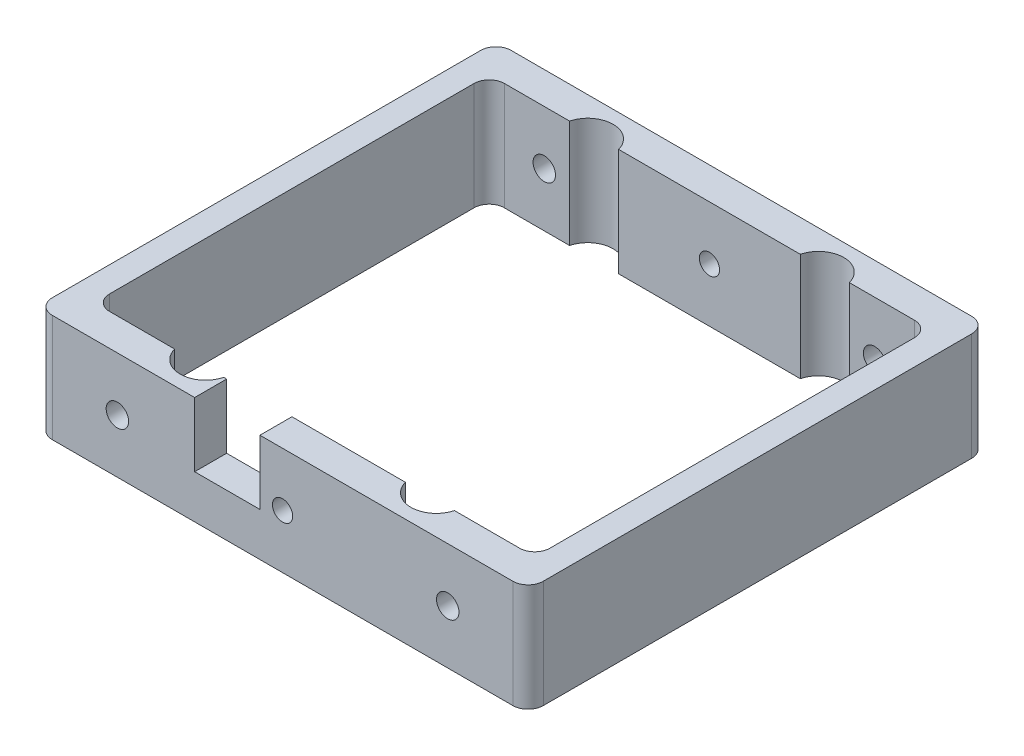
ISO-10303-21;
HEADER;
FILE_DESCRIPTION(('STEP AP214'),'2;1');
FILE_NAME('part.step','',(''),(''),'','','');
FILE_SCHEMA(('AUTOMOTIVE_DESIGN { 1 0 10303 214 1 1 1 1 }'));
ENDSEC;
DATA;
#1=APPLICATION_CONTEXT('core data for automotive mechanical design processes');
#2=APPLICATION_PROTOCOL_DEFINITION('international standard','automotive_design',2000,#1);
#3=PRODUCT_CONTEXT('',#1,'mechanical');
#4=PRODUCT('Part','Part','',(#3));
#5=PRODUCT_RELATED_PRODUCT_CATEGORY('part','',(#4));
#6=PRODUCT_DEFINITION_FORMATION('','',#4);
#7=PRODUCT_DEFINITION_CONTEXT('part definition',#1,'design');
#8=PRODUCT_DEFINITION('design','',#6,#7);
#9=PRODUCT_DEFINITION_SHAPE('','',#8);
#10=(LENGTH_UNIT() NAMED_UNIT(*) SI_UNIT(.MILLI.,.METRE.));
#11=(NAMED_UNIT(*) PLANE_ANGLE_UNIT() SI_UNIT($,.RADIAN.));
#12=(NAMED_UNIT(*) SI_UNIT($,.STERADIAN.) SOLID_ANGLE_UNIT());
#13=UNCERTAINTY_MEASURE_WITH_UNIT(LENGTH_MEASURE(1.E-05),#10,'distance_accuracy_value','');
#14=(GEOMETRIC_REPRESENTATION_CONTEXT(3) GLOBAL_UNCERTAINTY_ASSIGNED_CONTEXT((#13)) GLOBAL_UNIT_ASSIGNED_CONTEXT((#10,
#11,#12)) REPRESENTATION_CONTEXT('',''));
#15=CARTESIAN_POINT('',(0.,0.,0.));
#16=DIRECTION('',(0.,0.,1.));
#17=DIRECTION('',(1.,0.,0.));
#18=AXIS2_PLACEMENT_3D('',#15,#16,#17);
#19=CARTESIAN_POINT('',(-18.5,10.64,-78.01));
#20=DIRECTION('',(0.,0.,-1.));
#21=DIRECTION('',(-1.,0.,0.));
#22=AXIS2_PLACEMENT_3D('',#19,#20,#21);
#23=PLANE('',#22);
#24=CARTESIAN_POINT('',(-2.63122918275928,0.0049999999999998,-78.01));
#25=DIRECTION('',(0.,0.,-1.));
#26=DIRECTION('',(-1.,0.,0.));
#27=AXIS2_PLACEMENT_3D('',#24,#25,#26);
#28=CIRCLE('',#27,2.22000000000001);
#29=CARTESIAN_POINT('',(-4.85122918275928,0.0049999999999998,-78.01));
#30=VERTEX_POINT('',#29);
#31=EDGE_CURVE('E311',#30,#30,#28,.T.);
#32=ORIENTED_EDGE('',*,*,#31,.T.);
#33=EDGE_LOOP('',(#32));
#34=FACE_BOUND('',#33,.T.);
#35=DIRECTION('',(1.,0.,0.));
#36=VECTOR('',#35,1.);
#37=CARTESIAN_POINT('',(-18.5,10.64,-78.01));
#38=LINE('',#37,#36);
#39=CARTESIAN_POINT('',(-10.5,10.64,-78.01));
#40=VERTEX_POINT('',#39);
#41=CARTESIAN_POINT('',(2.36877081724072,10.64,-78.01));
#42=VERTEX_POINT('',#41);
#43=EDGE_CURVE('E331',#40,#42,#38,.T.);
#44=ORIENTED_EDGE('',*,*,#43,.F.);
#45=DIRECTION('',(0.,-1.,0.));
#46=VECTOR('',#45,1.);
#47=CARTESIAN_POINT('',(-10.5,-10.64,-78.01));
#48=LINE('',#47,#46);
#49=CARTESIAN_POINT('',(-10.5,-10.64,-78.01));
#50=VERTEX_POINT('',#49);
#51=EDGE_CURVE('E433',#40,#50,#48,.T.);
#52=ORIENTED_EDGE('',*,*,#51,.T.);
#53=DIRECTION('',(-1.,0.,0.));
#54=VECTOR('',#53,1.);
#55=CARTESIAN_POINT('',(0.,-10.64,-78.01));
#56=LINE('',#55,#54);
#57=CARTESIAN_POINT('',(-18.5,-10.64,-78.01));
#58=VERTEX_POINT('',#57);
#59=EDGE_CURVE('E338',#50,#58,#56,.T.);
#60=ORIENTED_EDGE('',*,*,#59,.T.);
#61=DIRECTION('',(0.,1.,0.));
#62=VECTOR('',#61,1.);
#63=CARTESIAN_POINT('',(-18.5,10.64,-78.01));
#64=LINE('',#63,#62);
#65=CARTESIAN_POINT('',(-18.5,-10.6519547348682,-78.01));
#66=VERTEX_POINT('',#65);
#67=EDGE_CURVE('E327',#66,#58,#64,.T.);
#68=ORIENTED_EDGE('',*,*,#67,.F.);
#69=DIRECTION('',(1.,0.,0.));
#70=VECTOR('',#69,1.);
#71=CARTESIAN_POINT('',(-18.5,-10.6519547348682,-78.01));
#72=LINE('',#71,#70);
#73=CARTESIAN_POINT('',(2.36877081724072,-10.6519547348682,-78.01));
#74=VERTEX_POINT('',#73);
#75=EDGE_CURVE('E335',#66,#74,#72,.T.);
#76=ORIENTED_EDGE('',*,*,#75,.T.);
#77=DIRECTION('',(0.,1.,0.));
#78=VECTOR('',#77,1.);
#79=CARTESIAN_POINT('',(2.36877081724072,-10.6519547348682,-78.01));
#80=LINE('',#79,#78);
#81=EDGE_CURVE('E430',#74,#42,#80,.T.);
#82=ORIENTED_EDGE('',*,*,#81,.T.);
#83=EDGE_LOOP('',(#44,#52,#60,#68,#76,#82));
#84=FACE_BOUND('',#83,.T.);
#85=ADVANCED_FACE('F45',(#34,#84),#23,.F.);
#86=CARTESIAN_POINT('',(30.,0.0049999999999998,-78.01));
#87=DIRECTION('',(0.,0.,-1.));
#88=DIRECTION('',(-1.,0.,0.));
#89=AXIS2_PLACEMENT_3D('',#86,#87,#88);
#90=CIRCLE('',#89,2.);
#91=CARTESIAN_POINT('',(28.,0.0049999999999998,-78.01));
#92=VERTEX_POINT('',#91);
#93=EDGE_CURVE('E289',#92,#92,#90,.T.);
#94=ORIENTED_EDGE('',*,*,#93,.T.);
#95=EDGE_LOOP('',(#94));
#96=FACE_BOUND('',#95,.T.);
#97=CARTESIAN_POINT('',(12.0512291827593,10.64,-78.01));
#98=VERTEX_POINT('',#97);
#99=CARTESIAN_POINT('',(47.9487708172407,10.64,-78.01));
#100=VERTEX_POINT('',#99);
#101=EDGE_CURVE('E334',#98,#100,#38,.T.);
#102=ORIENTED_EDGE('',*,*,#101,.F.);
#103=DIRECTION('',(0.,1.,0.));
#104=VECTOR('',#103,1.);
#105=CARTESIAN_POINT('',(12.0512291827593,-10.6519547348682,-78.01));
#106=LINE('',#105,#104);
#107=CARTESIAN_POINT('',(12.0512291827593,-10.6519547348682,-78.01));
#108=VERTEX_POINT('',#107);
#109=EDGE_CURVE('E427',#98,#108,#106,.F.);
#110=ORIENTED_EDGE('',*,*,#109,.T.);
#111=CARTESIAN_POINT('',(47.9487708172407,-10.6519547348682,-78.01));
#112=VERTEX_POINT('',#111);
#113=EDGE_CURVE('E339',#108,#112,#72,.T.);
#114=ORIENTED_EDGE('',*,*,#113,.T.);
#115=DIRECTION('',(0.,1.,0.));
#116=VECTOR('',#115,1.);
#117=CARTESIAN_POINT('',(47.9487708172407,-10.6519547348682,-78.01));
#118=LINE('',#117,#116);
#119=EDGE_CURVE('E424',#112,#100,#118,.T.);
#120=ORIENTED_EDGE('',*,*,#119,.T.);
#121=EDGE_LOOP('',(#102,#110,#114,#120));
#122=FACE_BOUND('',#121,.T.);
#123=ADVANCED_FACE('F552',(#96,#122),#23,.F.);
#124=CARTESIAN_POINT('',(0.,-10.64,0.));
#125=DIRECTION('',(0.,1.,0.));
#126=DIRECTION('',(0.,0.,1.));
#127=AXIS2_PLACEMENT_3D('',#124,#125,#126);
#128=PLANE('',#127);
#129=DIRECTION('',(1.,0.,0.));
#130=VECTOR('',#129,1.);
#131=CARTESIAN_POINT('',(0.,-10.64,6.32));
#132=LINE('',#131,#130);
#133=CARTESIAN_POINT('',(-15.5,-10.64,6.32));
#134=VERTEX_POINT('',#133);
#135=CARTESIAN_POINT('',(75.5,-10.64,6.32));
#136=VERTEX_POINT('',#135);
#137=EDGE_CURVE('E398',#134,#136,#132,.T.);
#138=ORIENTED_EDGE('',*,*,#137,.F.);
#139=CARTESIAN_POINT('',(-15.5,-10.64,3.32));
#140=DIRECTION('',(0.,1.,0.));
#141=DIRECTION('',(0.,0.,1.));
#142=AXIS2_PLACEMENT_3D('',#139,#140,#141);
#143=CIRCLE('',#142,3.);
#144=CARTESIAN_POINT('',(-18.5,-10.64,3.32));
#145=VERTEX_POINT('',#144);
#146=EDGE_CURVE('E491',#134,#145,#143,.F.);
#147=ORIENTED_EDGE('',*,*,#146,.T.);
#148=DIRECTION('',(0.,0.,1.));
#149=VECTOR('',#148,1.);
#150=CARTESIAN_POINT('',(-18.5,-10.64,0.));
#151=LINE('',#150,#149);
#152=EDGE_CURVE('E369',#58,#145,#151,.T.);
#153=ORIENTED_EDGE('',*,*,#152,.F.);
#154=ORIENTED_EDGE('',*,*,#59,.F.);
#155=CARTESIAN_POINT('',(-10.5,-10.64,-75.01));
#156=DIRECTION('',(0.,1.,0.));
#157=DIRECTION('',(0.,0.,1.));
#158=AXIS2_PLACEMENT_3D('',#155,#156,#157);
#159=CIRCLE('',#158,3.);
#160=CARTESIAN_POINT('',(-13.5,-10.64,-75.01));
#161=VERTEX_POINT('',#160);
#162=EDGE_CURVE('E493',#50,#161,#159,.T.);
#163=ORIENTED_EDGE('',*,*,#162,.T.);
#164=DIRECTION('',(0.,0.,1.));
#165=VECTOR('',#164,1.);
#166=CARTESIAN_POINT('',(-13.5,-10.64,-84.33));
#167=LINE('',#166,#165);
#168=CARTESIAN_POINT('',(-13.5,-10.64,-3.));
#169=VERTEX_POINT('',#168);
#170=EDGE_CURVE('E363',#161,#169,#167,.T.);
#171=ORIENTED_EDGE('',*,*,#170,.T.);
#172=CARTESIAN_POINT('',(-10.5,-10.64,-3.));
#173=DIRECTION('',(0.,1.,0.));
#174=DIRECTION('',(0.,0.,1.));
#175=AXIS2_PLACEMENT_3D('',#172,#173,#174);
#176=CIRCLE('',#175,3.);
#177=CARTESIAN_POINT('',(-10.5,-10.64,0.));
#178=VERTEX_POINT('',#177);
#179=EDGE_CURVE('E497',#169,#178,#176,.T.);
#180=ORIENTED_EDGE('',*,*,#179,.T.);
#181=DIRECTION('',(-1.,0.,0.));
#182=VECTOR('',#181,1.);
#183=CARTESIAN_POINT('',(0.,-10.64,0.));
#184=LINE('',#183,#182);
#185=CARTESIAN_POINT('',(2.36877081724073,-10.64,0.));
#186=VERTEX_POINT('',#185);
#187=EDGE_CURVE('E410',#186,#178,#184,.T.);
#188=ORIENTED_EDGE('',*,*,#187,.F.);
#189=CARTESIAN_POINT('',(7.21,-10.64,-1.25));
#190=DIRECTION('',(0.,1.,0.));
#191=DIRECTION('',(0.,0.,1.));
#192=AXIS2_PLACEMENT_3D('',#189,#190,#191);
#193=CIRCLE('',#192,5.);
#194=CARTESIAN_POINT('',(12.0512291827593,-10.64,0.));
#195=VERTEX_POINT('',#194);
#196=EDGE_CURVE('E418',#186,#195,#193,.T.);
#197=ORIENTED_EDGE('',*,*,#196,.T.);
#198=CARTESIAN_POINT('',(47.9487708172407,-10.64,0.));
#199=VERTEX_POINT('',#198);
#200=EDGE_CURVE('E415',#199,#195,#184,.T.);
#201=ORIENTED_EDGE('',*,*,#200,.F.);
#202=CARTESIAN_POINT('',(52.79,-10.64,-1.25));
#203=DIRECTION('',(0.,1.,0.));
#204=DIRECTION('',(0.,0.,1.));
#205=AXIS2_PLACEMENT_3D('',#202,#203,#204);
#206=CIRCLE('',#205,5.);
#207=CARTESIAN_POINT('',(57.6312291827593,-10.64,0.));
#208=VERTEX_POINT('',#207);
#209=EDGE_CURVE('E405',#199,#208,#206,.T.);
#210=ORIENTED_EDGE('',*,*,#209,.T.);
#211=CARTESIAN_POINT('',(70.5,-10.64,0.));
#212=VERTEX_POINT('',#211);
#213=EDGE_CURVE('E414',#212,#208,#184,.T.);
#214=ORIENTED_EDGE('',*,*,#213,.F.);
#215=CARTESIAN_POINT('',(70.5,-10.64,-3.));
#216=DIRECTION('',(0.,1.,0.));
#217=DIRECTION('',(0.,0.,1.));
#218=AXIS2_PLACEMENT_3D('',#215,#216,#217);
#219=CIRCLE('',#218,3.);
#220=CARTESIAN_POINT('',(73.5,-10.64,-3.));
#221=VERTEX_POINT('',#220);
#222=EDGE_CURVE('E507',#212,#221,#219,.T.);
#223=ORIENTED_EDGE('',*,*,#222,.T.);
#224=DIRECTION('',(0.,0.,-1.));
#225=VECTOR('',#224,1.);
#226=CARTESIAN_POINT('',(73.5,-10.64,0.));
#227=LINE('',#226,#225);
#228=CARTESIAN_POINT('',(73.5,-10.64,0.));
#229=VERTEX_POINT('',#228);
#230=EDGE_CURVE('E68',#229,#221,#227,.T.);
#231=ORIENTED_EDGE('',*,*,#230,.F.);
#232=CARTESIAN_POINT('',(78.5,-10.64,0.));
#233=VERTEX_POINT('',#232);
#234=EDGE_CURVE('E411',#233,#229,#184,.T.);
#235=ORIENTED_EDGE('',*,*,#234,.F.);
#236=DIRECTION('',(0.,0.,-1.));
#237=VECTOR('',#236,1.);
#238=CARTESIAN_POINT('',(78.5,-10.64,6.32));
#239=LINE('',#238,#237);
#240=CARTESIAN_POINT('',(78.5,-10.64,3.32));
#241=VERTEX_POINT('',#240);
#242=EDGE_CURVE('E375',#241,#233,#239,.T.);
#243=ORIENTED_EDGE('',*,*,#242,.F.);
#244=CARTESIAN_POINT('',(75.5,-10.64,3.32));
#245=DIRECTION('',(0.,1.,0.));
#246=DIRECTION('',(0.,0.,1.));
#247=AXIS2_PLACEMENT_3D('',#244,#245,#246);
#248=CIRCLE('',#247,3.);
#249=EDGE_CURVE('E489',#241,#136,#248,.F.);
#250=ORIENTED_EDGE('',*,*,#249,.T.);
#251=EDGE_LOOP('',(#138,#147,#153,#154,#163,#171,#180,#188,#197,#201,#210,#214,#223,#231,#235,
#243,#250));
#252=FACE_BOUND('',#251,.T.);
#253=ADVANCED_FACE('F533',(#252),#128,.F.);
#254=CARTESIAN_POINT('',(-13.5,10.64,-84.33));
#255=DIRECTION('',(-1.,0.,0.));
#256=DIRECTION('',(0.,-1.,0.));
#257=AXIS2_PLACEMENT_3D('',#254,#255,#256);
#258=PLANE('',#257);
#259=ORIENTED_EDGE('',*,*,#170,.F.);
#260=DIRECTION('',(0.,-1.,0.));
#261=VECTOR('',#260,1.);
#262=CARTESIAN_POINT('',(-13.5,10.64,-75.01));
#263=LINE('',#262,#261);
#264=CARTESIAN_POINT('',(-13.5,10.64,-75.01));
#265=VERTEX_POINT('',#264);
#266=EDGE_CURVE('E441',#161,#265,#263,.F.);
#267=ORIENTED_EDGE('',*,*,#266,.T.);
#268=DIRECTION('',(0.,0.,1.));
#269=VECTOR('',#268,1.);
#270=CARTESIAN_POINT('',(-13.5,10.64,-84.33));
#271=LINE('',#270,#269);
#272=CARTESIAN_POINT('',(-13.5,10.64,-3.));
#273=VERTEX_POINT('',#272);
#274=EDGE_CURVE('E366',#265,#273,#271,.T.);
#275=ORIENTED_EDGE('',*,*,#274,.T.);
#276=DIRECTION('',(0.,-1.,0.));
#277=VECTOR('',#276,1.);
#278=CARTESIAN_POINT('',(-13.5,-10.64,-3.));
#279=LINE('',#278,#277);
#280=EDGE_CURVE('E438',#273,#169,#279,.T.);
#281=ORIENTED_EDGE('',*,*,#280,.T.);
#282=EDGE_LOOP('',(#259,#267,#275,#281));
#283=FACE_BOUND('',#282,.T.);
#284=ADVANCED_FACE('F530',(#283),#258,.F.);
#285=CARTESIAN_POINT('',(73.5,10.64,-84.33));
#286=DIRECTION('',(1.,0.,0.));
#287=DIRECTION('',(0.,0.,-1.));
#288=AXIS2_PLACEMENT_3D('',#285,#286,#287);
#289=PLANE('',#288);
#290=DIRECTION('',(0.,0.,1.));
#291=VECTOR('',#290,1.);
#292=CARTESIAN_POINT('',(73.5,10.64,-84.33));
#293=LINE('',#292,#291);
#294=CARTESIAN_POINT('',(73.5,10.64,-75.01));
#295=VERTEX_POINT('',#294);
#296=CARTESIAN_POINT('',(73.5,10.64,-3.));
#297=VERTEX_POINT('',#296);
#298=EDGE_CURVE('E346',#295,#297,#293,.T.);
#299=ORIENTED_EDGE('',*,*,#298,.F.);
#300=DIRECTION('',(0.,1.,0.));
#301=VECTOR('',#300,1.);
#302=CARTESIAN_POINT('',(73.5,-10.6519547348682,-75.01));
#303=LINE('',#302,#301);
#304=CARTESIAN_POINT('',(73.5,-10.6519547348682,-75.01));
#305=VERTEX_POINT('',#304);
#306=EDGE_CURVE('E452',#295,#305,#303,.F.);
#307=ORIENTED_EDGE('',*,*,#306,.T.);
#308=DIRECTION('',(0.,0.,1.));
#309=VECTOR('',#308,1.);
#310=CARTESIAN_POINT('',(73.5,-10.6519547348682,-84.33));
#311=LINE('',#310,#309);
#312=CARTESIAN_POINT('',(73.5,-10.6519547348682,0.));
#313=VERTEX_POINT('',#312);
#314=EDGE_CURVE('E356',#305,#313,#311,.T.);
#315=ORIENTED_EDGE('',*,*,#314,.T.);
#316=DIRECTION('',(0.,1.,0.));
#317=VECTOR('',#316,1.);
#318=CARTESIAN_POINT('',(73.5,10.64,0.));
#319=LINE('',#318,#317);
#320=EDGE_CURVE('E347',#313,#229,#319,.T.);
#321=ORIENTED_EDGE('',*,*,#320,.T.);
#322=ORIENTED_EDGE('',*,*,#230,.T.);
#323=DIRECTION('',(0.,1.,0.));
#324=VECTOR('',#323,1.);
#325=CARTESIAN_POINT('',(73.5,10.64,-3.));
#326=LINE('',#325,#324);
#327=EDGE_CURVE('E449',#221,#297,#326,.T.);
#328=ORIENTED_EDGE('',*,*,#327,.T.);
#329=EDGE_LOOP('',(#299,#307,#315,#321,#322,#328));
#330=FACE_BOUND('',#329,.T.);
#331=ADVANCED_FACE('F571',(#330),#289,.F.);
#332=CARTESIAN_POINT('',(0.,10.64,0.));
#333=DIRECTION('',(0.,0.,1.));
#334=DIRECTION('',(1.,0.,0.));
#335=AXIS2_PLACEMENT_3D('',#332,#333,#334);
#336=PLANE('',#335);
#337=CARTESIAN_POINT('',(62.6312291827593,0.0049999999999998,0.));
#338=DIRECTION('',(0.,0.,1.));
#339=DIRECTION('',(1.,0.,0.));
#340=AXIS2_PLACEMENT_3D('',#337,#338,#339);
#341=CIRCLE('',#340,2.22000000000001);
#342=CARTESIAN_POINT('',(64.8512291827593,0.0049999999999998,0.));
#343=VERTEX_POINT('',#342);
#344=EDGE_CURVE('E305',#343,#343,#341,.T.);
#345=ORIENTED_EDGE('',*,*,#344,.T.);
#346=EDGE_LOOP('',(#345));
#347=FACE_BOUND('',#346,.T.);
#348=DIRECTION('',(-1.,0.,0.));
#349=VECTOR('',#348,1.);
#350=CARTESIAN_POINT('',(0.,10.64,0.));
#351=LINE('',#350,#349);
#352=CARTESIAN_POINT('',(70.5,10.64,0.));
#353=VERTEX_POINT('',#352);
#354=CARTESIAN_POINT('',(57.6312291827593,10.64,0.));
#355=VERTEX_POINT('',#354);
#356=EDGE_CURVE('E403',#353,#355,#351,.T.);
#357=ORIENTED_EDGE('',*,*,#356,.F.);
#358=DIRECTION('',(0.,1.,0.));
#359=VECTOR('',#358,1.);
#360=CARTESIAN_POINT('',(70.5,-10.64,0.));
#361=LINE('',#360,#359);
#362=EDGE_CURVE('E454',#353,#212,#361,.F.);
#363=ORIENTED_EDGE('',*,*,#362,.T.);
#364=ORIENTED_EDGE('',*,*,#213,.T.);
#365=DIRECTION('',(0.,1.,0.));
#366=VECTOR('',#365,1.);
#367=CARTESIAN_POINT('',(57.6312291827593,-10.64,0.));
#368=LINE('',#367,#366);
#369=EDGE_CURVE('E389',#208,#355,#368,.T.);
#370=ORIENTED_EDGE('',*,*,#369,.T.);
#371=EDGE_LOOP('',(#357,#363,#364,#370));
#372=FACE_BOUND('',#371,.T.);
#373=ADVANCED_FACE('F580',(#347,#372),#336,.F.);
#374=CARTESIAN_POINT('',(-2.63122918275928,0.0049999999999998,0.));
#375=DIRECTION('',(0.,0.,1.));
#376=DIRECTION('',(1.,0.,0.));
#377=AXIS2_PLACEMENT_3D('',#374,#375,#376);
#378=CIRCLE('',#377,2.22000000000001);
#379=CARTESIAN_POINT('',(-0.411229182759274,0.0049999999999998,0.));
#380=VERTEX_POINT('',#379);
#381=EDGE_CURVE('E308',#380,#380,#378,.T.);
#382=ORIENTED_EDGE('',*,*,#381,.T.);
#383=EDGE_LOOP('',(#382));
#384=FACE_BOUND('',#383,.T.);
#385=ORIENTED_EDGE('',*,*,#187,.T.);
#386=DIRECTION('',(0.,-1.,0.));
#387=VECTOR('',#386,1.);
#388=CARTESIAN_POINT('',(-10.5,10.64,0.));
#389=LINE('',#388,#387);
#390=CARTESIAN_POINT('',(-10.5,10.64,0.));
#391=VERTEX_POINT('',#390);
#392=EDGE_CURVE('E443',#178,#391,#389,.F.);
#393=ORIENTED_EDGE('',*,*,#392,.T.);
#394=CARTESIAN_POINT('',(2.36877081724073,10.64,0.));
#395=VERTEX_POINT('',#394);
#396=EDGE_CURVE('E401',#395,#391,#351,.T.);
#397=ORIENTED_EDGE('',*,*,#396,.F.);
#398=DIRECTION('',(0.,1.,0.));
#399=VECTOR('',#398,1.);
#400=CARTESIAN_POINT('',(2.36877081724073,-10.64,0.));
#401=LINE('',#400,#399);
#402=EDGE_CURVE('E392',#395,#186,#401,.F.);
#403=ORIENTED_EDGE('',*,*,#402,.T.);
#404=EDGE_LOOP('',(#385,#393,#397,#403));
#405=FACE_BOUND('',#404,.T.);
#406=ADVANCED_FACE('F587',(#384,#405),#336,.F.);
#407=CARTESIAN_POINT('',(12.6307012944861,10.64,0.));
#408=VERTEX_POINT('',#407);
#409=CARTESIAN_POINT('',(12.0512291827593,10.64,0.));
#410=VERTEX_POINT('',#409);
#411=EDGE_CURVE('E407',#408,#410,#351,.T.);
#412=ORIENTED_EDGE('',*,*,#411,.F.);
#413=DIRECTION('',(0.,1.,0.));
#414=VECTOR('',#413,1.);
#415=CARTESIAN_POINT('',(12.6307012944861,-2.06,0.));
#416=LINE('',#415,#414);
#417=CARTESIAN_POINT('',(12.6307012944861,-2.06,0.));
#418=VERTEX_POINT('',#417);
#419=EDGE_CURVE('E274',#418,#408,#416,.T.);
#420=ORIENTED_EDGE('',*,*,#419,.F.);
#421=DIRECTION('',(-1.,0.,0.));
#422=VECTOR('',#421,1.);
#423=CARTESIAN_POINT('',(12.6307012944861,-2.06,0.));
#424=LINE('',#423,#422);
#425=CARTESIAN_POINT('',(25.5307012944861,-2.06,0.));
#426=VERTEX_POINT('',#425);
#427=EDGE_CURVE('E257',#426,#418,#424,.T.);
#428=ORIENTED_EDGE('',*,*,#427,.F.);
#429=DIRECTION('',(0.,1.,0.));
#430=VECTOR('',#429,1.);
#431=CARTESIAN_POINT('',(25.5307012944861,-2.06,0.));
#432=LINE('',#431,#430);
#433=CARTESIAN_POINT('',(25.5307012944861,10.64,0.));
#434=VERTEX_POINT('',#433);
#435=EDGE_CURVE('E277',#426,#434,#432,.T.);
#436=ORIENTED_EDGE('',*,*,#435,.T.);
#437=CARTESIAN_POINT('',(47.9487708172407,10.64,0.));
#438=VERTEX_POINT('',#437);
#439=EDGE_CURVE('E406',#438,#434,#351,.T.);
#440=ORIENTED_EDGE('',*,*,#439,.F.);
#441=DIRECTION('',(0.,1.,0.));
#442=VECTOR('',#441,1.);
#443=CARTESIAN_POINT('',(47.9487708172407,-10.64,0.));
#444=LINE('',#443,#442);
#445=EDGE_CURVE('E384',#438,#199,#444,.F.);
#446=ORIENTED_EDGE('',*,*,#445,.T.);
#447=ORIENTED_EDGE('',*,*,#200,.T.);
#448=DIRECTION('',(0.,1.,0.));
#449=VECTOR('',#448,1.);
#450=CARTESIAN_POINT('',(12.0512291827593,-10.64,0.));
#451=LINE('',#450,#449);
#452=EDGE_CURVE('E395',#195,#410,#451,.T.);
#453=ORIENTED_EDGE('',*,*,#452,.T.);
#454=EDGE_LOOP('',(#412,#420,#428,#436,#440,#446,#447,#453));
#455=FACE_BOUND('',#454,.T.);
#456=CARTESIAN_POINT('',(30.,0.0049999999999998,0.));
#457=DIRECTION('',(0.,0.,1.));
#458=DIRECTION('',(1.,0.,0.));
#459=AXIS2_PLACEMENT_3D('',#456,#457,#458);
#460=CIRCLE('',#459,2.);
#461=CARTESIAN_POINT('',(32.,0.0049999999999998,0.));
#462=VERTEX_POINT('',#461);
#463=EDGE_CURVE('E284',#462,#462,#460,.T.);
#464=ORIENTED_EDGE('',*,*,#463,.T.);
#465=EDGE_LOOP('',(#464));
#466=FACE_BOUND('',#465,.T.);
#467=ADVANCED_FACE('F514',(#455,#466),#336,.F.);
#468=CARTESIAN_POINT('',(0.,10.64,6.32));
#469=DIRECTION('',(0.,0.,-1.));
#470=DIRECTION('',(-1.,0.,0.));
#471=AXIS2_PLACEMENT_3D('',#468,#469,#470);
#472=PLANE('',#471);
#473=CARTESIAN_POINT('',(30.,0.0049999999999998,6.32000000000001));
#474=DIRECTION('',(0.,0.,-1.));
#475=DIRECTION('',(-1.,0.,0.));
#476=AXIS2_PLACEMENT_3D('',#473,#474,#475);
#477=CIRCLE('',#476,2.);
#478=CARTESIAN_POINT('',(28.,0.0049999999999998,6.32000000000001));
#479=VERTEX_POINT('',#478);
#480=EDGE_CURVE('E281',#479,#479,#477,.T.);
#481=ORIENTED_EDGE('',*,*,#480,.T.);
#482=EDGE_LOOP('',(#481));
#483=FACE_BOUND('',#482,.T.);
#484=CARTESIAN_POINT('',(62.6312291827593,0.0049999999999998,6.32000000000001));
#485=DIRECTION('',(0.,0.,-1.));
#486=DIRECTION('',(-1.,0.,0.));
#487=AXIS2_PLACEMENT_3D('',#484,#485,#486);
#488=CIRCLE('',#487,2.22000000000001);
#489=CARTESIAN_POINT('',(60.4112291827593,0.0049999999999998,6.32000000000001));
#490=VERTEX_POINT('',#489);
#491=EDGE_CURVE('E293',#490,#490,#488,.T.);
#492=ORIENTED_EDGE('',*,*,#491,.T.);
#493=EDGE_LOOP('',(#492));
#494=FACE_BOUND('',#493,.T.);
#495=CARTESIAN_POINT('',(-2.63122918275928,0.0049999999999998,6.32000000000001));
#496=DIRECTION('',(0.,0.,-1.));
#497=DIRECTION('',(1.,0.,0.));
#498=AXIS2_PLACEMENT_3D('',#495,#496,#497);
#499=CIRCLE('',#498,2.22000000000001);
#500=CARTESIAN_POINT('',(-0.411229182759274,0.0049999999999998,6.32000000000001));
#501=VERTEX_POINT('',#500);
#502=EDGE_CURVE('E292',#501,#501,#499,.T.);
#503=ORIENTED_EDGE('',*,*,#502,.T.);
#504=EDGE_LOOP('',(#503));
#505=FACE_BOUND('',#504,.T.);
#506=DIRECTION('',(1.,0.,0.));
#507=VECTOR('',#506,1.);
#508=CARTESIAN_POINT('',(12.6307012944861,-2.06,6.32));
#509=LINE('',#508,#507);
#510=CARTESIAN_POINT('',(12.6307012944861,-2.06,6.32));
#511=VERTEX_POINT('',#510);
#512=CARTESIAN_POINT('',(25.5307012944861,-2.06,6.32));
#513=VERTEX_POINT('',#512);
#514=EDGE_CURVE('E263',#511,#513,#509,.T.);
#515=ORIENTED_EDGE('',*,*,#514,.F.);
#516=DIRECTION('',(0.,1.,0.));
#517=VECTOR('',#516,1.);
#518=CARTESIAN_POINT('',(12.6307012944861,-2.06,6.32));
#519=LINE('',#518,#517);
#520=CARTESIAN_POINT('',(12.6307012944861,10.64,6.32));
#521=VERTEX_POINT('',#520);
#522=EDGE_CURVE('E247',#511,#521,#519,.T.);
#523=ORIENTED_EDGE('',*,*,#522,.T.);
#524=DIRECTION('',(1.,0.,0.));
#525=VECTOR('',#524,1.);
#526=CARTESIAN_POINT('',(0.,10.64,6.32));
#527=LINE('',#526,#525);
#528=CARTESIAN_POINT('',(-15.5,10.64,6.32));
#529=VERTEX_POINT('',#528);
#530=EDGE_CURVE('E399',#529,#521,#527,.T.);
#531=ORIENTED_EDGE('',*,*,#530,.F.);
#532=DIRECTION('',(0.,1.,0.));
#533=VECTOR('',#532,1.);
#534=CARTESIAN_POINT('',(-15.5,-10.64,6.32));
#535=LINE('',#534,#533);
#536=EDGE_CURVE('E487',#529,#134,#535,.F.);
#537=ORIENTED_EDGE('',*,*,#536,.T.);
#538=ORIENTED_EDGE('',*,*,#137,.T.);
#539=DIRECTION('',(0.,-1.,0.));
#540=VECTOR('',#539,1.);
#541=CARTESIAN_POINT('',(75.5,10.64,6.32));
#542=LINE('',#541,#540);
#543=CARTESIAN_POINT('',(75.5,10.64,6.32));
#544=VERTEX_POINT('',#543);
#545=EDGE_CURVE('E484',#136,#544,#542,.F.);
#546=ORIENTED_EDGE('',*,*,#545,.T.);
#547=CARTESIAN_POINT('',(25.5307012944861,10.64,6.32));
#548=VERTEX_POINT('',#547);
#549=EDGE_CURVE('E402',#548,#544,#527,.T.);
#550=ORIENTED_EDGE('',*,*,#549,.F.);
#551=DIRECTION('',(0.,1.,0.));
#552=VECTOR('',#551,1.);
#553=CARTESIAN_POINT('',(25.5307012944861,-2.06,6.32));
#554=LINE('',#553,#552);
#555=EDGE_CURVE('E60',#513,#548,#554,.T.);
#556=ORIENTED_EDGE('',*,*,#555,.F.);
#557=EDGE_LOOP('',(#515,#523,#531,#537,#538,#546,#550,#556));
#558=FACE_BOUND('',#557,.T.);
#559=ADVANCED_FACE('F267',(#483,#494,#505,#558),#472,.F.);
#560=CARTESIAN_POINT('',(0.,10.64,0.));
#561=DIRECTION('',(0.,1.,0.));
#562=DIRECTION('',(0.,0.,1.));
#563=AXIS2_PLACEMENT_3D('',#560,#561,#562);
#564=PLANE('',#563);
#565=DIRECTION('',(0.,0.,1.));
#566=VECTOR('',#565,1.);
#567=CARTESIAN_POINT('',(12.6307012944861,10.64,0.));
#568=LINE('',#567,#566);
#569=EDGE_CURVE('E12',#408,#521,#568,.T.);
#570=ORIENTED_EDGE('',*,*,#569,.F.);
#571=ORIENTED_EDGE('',*,*,#411,.T.);
#572=CARTESIAN_POINT('',(7.21,10.64,-1.25));
#573=DIRECTION('',(0.,1.,0.));
#574=DIRECTION('',(0.,0.,1.));
#575=AXIS2_PLACEMENT_3D('',#572,#573,#574);
#576=CIRCLE('',#575,5.);
#577=EDGE_CURVE('E381',#395,#410,#576,.T.);
#578=ORIENTED_EDGE('',*,*,#577,.F.);
#579=ORIENTED_EDGE('',*,*,#396,.T.);
#580=CARTESIAN_POINT('',(-10.5,10.64,-3.));
#581=DIRECTION('',(0.,1.,0.));
#582=DIRECTION('',(0.,0.,1.));
#583=AXIS2_PLACEMENT_3D('',#580,#581,#582);
#584=CIRCLE('',#583,3.);
#585=EDGE_CURVE('E499',#391,#273,#584,.F.);
#586=ORIENTED_EDGE('',*,*,#585,.T.);
#587=ORIENTED_EDGE('',*,*,#274,.F.);
#588=CARTESIAN_POINT('',(-10.5,10.64,-75.01));
#589=DIRECTION('',(0.,1.,0.));
#590=DIRECTION('',(0.,0.,1.));
#591=AXIS2_PLACEMENT_3D('',#588,#589,#590);
#592=CIRCLE('',#591,3.);
#593=EDGE_CURVE('E495',#265,#40,#592,.F.);
#594=ORIENTED_EDGE('',*,*,#593,.T.);
#595=ORIENTED_EDGE('',*,*,#43,.T.);
#596=CARTESIAN_POINT('',(7.21,10.64,-76.76));
#597=DIRECTION('',(0.,1.,0.));
#598=DIRECTION('',(0.,0.,1.));
#599=AXIS2_PLACEMENT_3D('',#596,#597,#598);
#600=CIRCLE('',#599,5.);
#601=EDGE_CURVE('E319',#98,#42,#600,.T.);
#602=ORIENTED_EDGE('',*,*,#601,.F.);
#603=ORIENTED_EDGE('',*,*,#101,.T.);
#604=CARTESIAN_POINT('',(52.79,10.64,-76.76));
#605=DIRECTION('',(0.,1.,0.));
#606=DIRECTION('',(0.,0.,1.));
#607=AXIS2_PLACEMENT_3D('',#604,#605,#606);
#608=CIRCLE('',#607,5.);
#609=CARTESIAN_POINT('',(57.6312291827593,10.64,-78.01));
#610=VERTEX_POINT('',#609);
#611=EDGE_CURVE('E322',#610,#100,#608,.T.);
#612=ORIENTED_EDGE('',*,*,#611,.F.);
#613=CARTESIAN_POINT('',(70.5,10.64,-78.01));
#614=VERTEX_POINT('',#613);
#615=EDGE_CURVE('E330',#610,#614,#38,.T.);
#616=ORIENTED_EDGE('',*,*,#615,.T.);
#617=CARTESIAN_POINT('',(70.5,10.64,-75.01));
#618=DIRECTION('',(0.,1.,0.));
#619=DIRECTION('',(0.,0.,1.));
#620=AXIS2_PLACEMENT_3D('',#617,#618,#619);
#621=CIRCLE('',#620,3.);
#622=EDGE_CURVE('E501',#614,#295,#621,.F.);
#623=ORIENTED_EDGE('',*,*,#622,.T.);
#624=ORIENTED_EDGE('',*,*,#298,.T.);
#625=CARTESIAN_POINT('',(70.5,10.64,-3.));
#626=DIRECTION('',(0.,1.,0.));
#627=DIRECTION('',(0.,0.,1.));
#628=AXIS2_PLACEMENT_3D('',#625,#626,#627);
#629=CIRCLE('',#628,3.);
#630=EDGE_CURVE('E505',#297,#353,#629,.F.);
#631=ORIENTED_EDGE('',*,*,#630,.T.);
#632=ORIENTED_EDGE('',*,*,#356,.T.);
#633=CARTESIAN_POINT('',(52.79,10.64,-1.25));
#634=DIRECTION('',(0.,1.,0.));
#635=DIRECTION('',(0.,0.,1.));
#636=AXIS2_PLACEMENT_3D('',#633,#634,#635);
#637=CIRCLE('',#636,5.);
#638=EDGE_CURVE('E380',#438,#355,#637,.T.);
#639=ORIENTED_EDGE('',*,*,#638,.F.);
#640=ORIENTED_EDGE('',*,*,#439,.T.);
#641=DIRECTION('',(0.,0.,-1.));
#642=VECTOR('',#641,1.);
#643=CARTESIAN_POINT('',(25.5307012944861,10.64,0.));
#644=LINE('',#643,#642);
#645=EDGE_CURVE('E53',#548,#434,#644,.T.);
#646=ORIENTED_EDGE('',*,*,#645,.F.);
#647=ORIENTED_EDGE('',*,*,#549,.T.);
#648=CARTESIAN_POINT('',(75.5,10.64,3.32));
#649=DIRECTION('',(0.,1.,0.));
#650=DIRECTION('',(0.,0.,1.));
#651=AXIS2_PLACEMENT_3D('',#648,#649,#650);
#652=CIRCLE('',#651,3.);
#653=CARTESIAN_POINT('',(78.5,10.64,3.32));
#654=VERTEX_POINT('',#653);
#655=EDGE_CURVE('E471',#544,#654,#652,.T.);
#656=ORIENTED_EDGE('',*,*,#655,.T.);
#657=DIRECTION('',(0.,0.,1.));
#658=VECTOR('',#657,1.);
#659=CARTESIAN_POINT('',(78.5,10.64,6.32));
#660=LINE('',#659,#658);
#661=CARTESIAN_POINT('',(78.5,10.64,-81.33));
#662=VERTEX_POINT('',#661);
#663=EDGE_CURVE('E377',#662,#654,#660,.T.);
#664=ORIENTED_EDGE('',*,*,#663,.F.);
#665=CARTESIAN_POINT('',(75.5,10.64,-81.33));
#666=DIRECTION('',(0.,1.,0.));
#667=DIRECTION('',(0.,0.,1.));
#668=AXIS2_PLACEMENT_3D('',#665,#666,#667);
#669=CIRCLE('',#668,3.);
#670=CARTESIAN_POINT('',(75.5,10.64,-84.33));
#671=VERTEX_POINT('',#670);
#672=EDGE_CURVE('E477',#662,#671,#669,.T.);
#673=ORIENTED_EDGE('',*,*,#672,.T.);
#674=DIRECTION('',(1.,0.,0.));
#675=VECTOR('',#674,1.);
#676=CARTESIAN_POINT('',(-18.5,10.64,-84.33));
#677=LINE('',#676,#675);
#678=CARTESIAN_POINT('',(-15.5,10.64,-84.33));
#679=VERTEX_POINT('',#678);
#680=EDGE_CURVE('E360',#679,#671,#677,.T.);
#681=ORIENTED_EDGE('',*,*,#680,.F.);
#682=CARTESIAN_POINT('',(-15.5,10.64,-81.33));
#683=DIRECTION('',(0.,1.,0.));
#684=DIRECTION('',(0.,0.,1.));
#685=AXIS2_PLACEMENT_3D('',#682,#683,#684);
#686=CIRCLE('',#685,3.);
#687=CARTESIAN_POINT('',(-18.5,10.64,-81.33));
#688=VERTEX_POINT('',#687);
#689=EDGE_CURVE('E475',#679,#688,#686,.T.);
#690=ORIENTED_EDGE('',*,*,#689,.T.);
#691=DIRECTION('',(0.,0.,-1.));
#692=VECTOR('',#691,1.);
#693=CARTESIAN_POINT('',(-18.5,10.64,0.));
#694=LINE('',#693,#692);
#695=CARTESIAN_POINT('',(-18.5,10.64,3.32));
#696=VERTEX_POINT('',#695);
#697=EDGE_CURVE('E372',#696,#688,#694,.T.);
#698=ORIENTED_EDGE('',*,*,#697,.F.);
#699=CARTESIAN_POINT('',(-15.5,10.64,3.32));
#700=DIRECTION('',(0.,1.,0.));
#701=DIRECTION('',(0.,0.,1.));
#702=AXIS2_PLACEMENT_3D('',#699,#700,#701);
#703=CIRCLE('',#702,3.);
#704=EDGE_CURVE('E473',#696,#529,#703,.T.);
#705=ORIENTED_EDGE('',*,*,#704,.T.);
#706=ORIENTED_EDGE('',*,*,#530,.T.);
#707=EDGE_LOOP('',(#570,#571,#578,#579,#586,#587,#594,#595,#602,#603,#612,#616,#623,#624,#631,
#632,#639,#640,#646,#647,#656,#664,#673,#681,#690,#698,#705,#706));
#708=FACE_BOUND('',#707,.T.);
#709=ADVANCED_FACE('F517',(#708),#564,.T.);
#710=CARTESIAN_POINT('',(52.79,-10.64,-1.25));
#711=DIRECTION('',(0.,1.,0.));
#712=DIRECTION('',(0.,0.,1.));
#713=AXIS2_PLACEMENT_3D('',#710,#711,#712);
#714=CYLINDRICAL_SURFACE('',#713,5.);
#715=ORIENTED_EDGE('',*,*,#209,.F.);
#716=ORIENTED_EDGE('',*,*,#445,.F.);
#717=ORIENTED_EDGE('',*,*,#638,.T.);
#718=ORIENTED_EDGE('',*,*,#369,.F.);
#719=EDGE_LOOP('',(#715,#716,#717,#718));
#720=FACE_BOUND('',#719,.T.);
#721=ADVANCED_FACE('F584',(#720),#714,.F.);
#722=CARTESIAN_POINT('',(7.21,-10.64,-1.25));
#723=DIRECTION('',(0.,1.,0.));
#724=DIRECTION('',(0.,0.,1.));
#725=AXIS2_PLACEMENT_3D('',#722,#723,#724);
#726=CYLINDRICAL_SURFACE('',#725,5.);
#727=ORIENTED_EDGE('',*,*,#196,.F.);
#728=ORIENTED_EDGE('',*,*,#402,.F.);
#729=ORIENTED_EDGE('',*,*,#577,.T.);
#730=ORIENTED_EDGE('',*,*,#452,.F.);
#731=EDGE_LOOP('',(#727,#728,#729,#730));
#732=FACE_BOUND('',#731,.T.);
#733=ADVANCED_FACE('F589',(#732),#726,.F.);
#734=CARTESIAN_POINT('',(78.5,0.,0.));
#735=DIRECTION('',(1.,0.,0.));
#736=DIRECTION('',(0.,0.,-1.));
#737=AXIS2_PLACEMENT_3D('',#734,#735,#736);
#738=PLANE('',#737);
#739=DIRECTION('',(0.,0.,1.));
#740=VECTOR('',#739,1.);
#741=CARTESIAN_POINT('',(78.5,-10.6519547348682,-84.33));
#742=LINE('',#741,#740);
#743=CARTESIAN_POINT('',(78.5,-10.6519547348682,-81.33));
#744=VERTEX_POINT('',#743);
#745=CARTESIAN_POINT('',(78.5,-10.6519547348682,0.));
#746=VERTEX_POINT('',#745);
#747=EDGE_CURVE('E358',#744,#746,#742,.T.);
#748=ORIENTED_EDGE('',*,*,#747,.F.);
#749=DIRECTION('',(0.,-1.,0.));
#750=VECTOR('',#749,1.);
#751=CARTESIAN_POINT('',(78.5,10.64,-81.33));
#752=LINE('',#751,#750);
#753=EDGE_CURVE('E469',#744,#662,#752,.F.);
#754=ORIENTED_EDGE('',*,*,#753,.T.);
#755=ORIENTED_EDGE('',*,*,#663,.T.);
#756=DIRECTION('',(0.,-1.,0.));
#757=VECTOR('',#756,1.);
#758=CARTESIAN_POINT('',(78.5,-10.64,3.32));
#759=LINE('',#758,#757);
#760=EDGE_CURVE('E466',#654,#241,#759,.T.);
#761=ORIENTED_EDGE('',*,*,#760,.T.);
#762=ORIENTED_EDGE('',*,*,#242,.T.);
#763=DIRECTION('',(0.,-1.,0.));
#764=VECTOR('',#763,1.);
#765=CARTESIAN_POINT('',(78.5,10.64,0.));
#766=LINE('',#765,#764);
#767=EDGE_CURVE('E342',#233,#746,#766,.T.);
#768=ORIENTED_EDGE('',*,*,#767,.T.);
#769=EDGE_LOOP('',(#748,#754,#755,#761,#762,#768));
#770=FACE_BOUND('',#769,.T.);
#771=ADVANCED_FACE('F615',(#770),#738,.T.);
#772=CARTESIAN_POINT('',(-18.5,0.,0.));
#773=DIRECTION('',(-1.,0.,0.));
#774=DIRECTION('',(0.,0.,1.));
#775=AXIS2_PLACEMENT_3D('',#772,#773,#774);
#776=PLANE('',#775);
#777=ORIENTED_EDGE('',*,*,#697,.T.);
#778=DIRECTION('',(0.,1.,0.));
#779=VECTOR('',#778,1.);
#780=CARTESIAN_POINT('',(-18.5,-10.6519547348682,-81.33));
#781=LINE('',#780,#779);
#782=CARTESIAN_POINT('',(-18.5,-10.6519547348682,-81.33));
#783=VERTEX_POINT('',#782);
#784=EDGE_CURVE('E482',#688,#783,#781,.F.);
#785=ORIENTED_EDGE('',*,*,#784,.T.);
#786=DIRECTION('',(0.,0.,1.));
#787=VECTOR('',#786,1.);
#788=CARTESIAN_POINT('',(-18.5,-10.6519547348682,-84.33));
#789=LINE('',#788,#787);
#790=EDGE_CURVE('E318',#783,#66,#789,.T.);
#791=ORIENTED_EDGE('',*,*,#790,.T.);
#792=ORIENTED_EDGE('',*,*,#67,.T.);
#793=ORIENTED_EDGE('',*,*,#152,.T.);
#794=DIRECTION('',(0.,1.,0.));
#795=VECTOR('',#794,1.);
#796=CARTESIAN_POINT('',(-18.5,10.64,3.32));
#797=LINE('',#796,#795);
#798=EDGE_CURVE('E479',#145,#696,#797,.T.);
#799=ORIENTED_EDGE('',*,*,#798,.T.);
#800=EDGE_LOOP('',(#777,#785,#791,#792,#793,#799));
#801=FACE_BOUND('',#800,.T.);
#802=ADVANCED_FACE('F597',(#801),#776,.T.);
#803=CARTESIAN_POINT('',(0.,0.,-84.33));
#804=DIRECTION('',(0.,0.,1.));
#805=DIRECTION('',(1.,0.,0.));
#806=AXIS2_PLACEMENT_3D('',#803,#804,#805);
#807=PLANE('',#806);
#808=CARTESIAN_POINT('',(30.,0.0049999999999998,-84.33));
#809=DIRECTION('',(0.,0.,-1.));
#810=DIRECTION('',(-1.,0.,0.));
#811=AXIS2_PLACEMENT_3D('',#808,#809,#810);
#812=CIRCLE('',#811,2.);
#813=CARTESIAN_POINT('',(28.,0.0049999999999998,-84.33));
#814=VERTEX_POINT('',#813);
#815=EDGE_CURVE('E276',#814,#814,#812,.T.);
#816=ORIENTED_EDGE('',*,*,#815,.F.);
#817=EDGE_LOOP('',(#816));
#818=FACE_BOUND('',#817,.T.);
#819=CARTESIAN_POINT('',(62.6312291827593,0.0049999999999998,-84.33));
#820=DIRECTION('',(0.,0.,-1.));
#821=DIRECTION('',(-1.,0.,0.));
#822=AXIS2_PLACEMENT_3D('',#819,#820,#821);
#823=CIRCLE('',#822,2.22000000000001);
#824=CARTESIAN_POINT('',(60.4112291827593,0.0049999999999998,-84.33));
#825=VERTEX_POINT('',#824);
#826=EDGE_CURVE('E297',#825,#825,#823,.T.);
#827=ORIENTED_EDGE('',*,*,#826,.F.);
#828=EDGE_LOOP('',(#827));
#829=FACE_BOUND('',#828,.T.);
#830=CARTESIAN_POINT('',(-2.63122918275928,0.0049999999999998,-84.33));
#831=DIRECTION('',(0.,0.,-1.));
#832=DIRECTION('',(1.,0.,0.));
#833=AXIS2_PLACEMENT_3D('',#830,#831,#832);
#834=CIRCLE('',#833,2.22000000000001);
#835=CARTESIAN_POINT('',(-0.411229182759274,0.0049999999999998,-84.33));
#836=VERTEX_POINT('',#835);
#837=EDGE_CURVE('E300',#836,#836,#834,.T.);
#838=ORIENTED_EDGE('',*,*,#837,.F.);
#839=EDGE_LOOP('',(#838));
#840=FACE_BOUND('',#839,.T.);
#841=ORIENTED_EDGE('',*,*,#680,.T.);
#842=DIRECTION('',(0.,-1.,0.));
#843=VECTOR('',#842,1.);
#844=CARTESIAN_POINT('',(75.5,-10.6519547348682,-84.33));
#845=LINE('',#844,#843);
#846=CARTESIAN_POINT('',(75.5,-10.6519547348682,-84.33));
#847=VERTEX_POINT('',#846);
#848=EDGE_CURVE('E459',#671,#847,#845,.T.);
#849=ORIENTED_EDGE('',*,*,#848,.T.);
#850=DIRECTION('',(-1.,0.,0.));
#851=VECTOR('',#850,1.);
#852=CARTESIAN_POINT('',(78.5,-10.6519547348682,-84.33));
#853=LINE('',#852,#851);
#854=CARTESIAN_POINT('',(-15.5,-10.6519547348682,-84.33));
#855=VERTEX_POINT('',#854);
#856=EDGE_CURVE('E343',#847,#855,#853,.T.);
#857=ORIENTED_EDGE('',*,*,#856,.T.);
#858=DIRECTION('',(0.,1.,0.));
#859=VECTOR('',#858,1.);
#860=CARTESIAN_POINT('',(-15.5,10.64,-84.33));
#861=LINE('',#860,#859);
#862=EDGE_CURVE('E456',#855,#679,#861,.T.);
#863=ORIENTED_EDGE('',*,*,#862,.T.);
#864=EDGE_LOOP('',(#841,#849,#857,#863));
#865=FACE_BOUND('',#864,.T.);
#866=ADVANCED_FACE('F606',(#818,#829,#840,#865),#807,.F.);
#867=CARTESIAN_POINT('',(0.,0.,0.));
#868=DIRECTION('',(0.,0.,-1.));
#869=DIRECTION('',(-1.,0.,0.));
#870=AXIS2_PLACEMENT_3D('',#867,#868,#869);
#871=PLANE('',#870);
#872=ORIENTED_EDGE('',*,*,#767,.F.);
#873=ORIENTED_EDGE('',*,*,#234,.T.);
#874=ORIENTED_EDGE('',*,*,#320,.F.);
#875=DIRECTION('',(-1.,0.,0.));
#876=VECTOR('',#875,1.);
#877=CARTESIAN_POINT('',(78.5,-10.6519547348682,0.));
#878=LINE('',#877,#876);
#879=EDGE_CURVE('E350',#746,#313,#878,.T.);
#880=ORIENTED_EDGE('',*,*,#879,.F.);
#881=EDGE_LOOP('',(#872,#873,#874,#880));
#882=FACE_BOUND('',#881,.T.);
#883=ADVANCED_FACE('F621',(#882),#871,.F.);
#884=CARTESIAN_POINT('',(78.5,-10.6519547348682,-84.33));
#885=DIRECTION('',(0.,1.,0.));
#886=DIRECTION('',(0.,0.,1.));
#887=AXIS2_PLACEMENT_3D('',#884,#885,#886);
#888=PLANE('',#887);
#889=ORIENTED_EDGE('',*,*,#856,.F.);
#890=CARTESIAN_POINT('',(75.5,-10.6519547348682,-81.33));
#891=DIRECTION('',(0.,1.,0.));
#892=DIRECTION('',(0.,0.,1.));
#893=AXIS2_PLACEMENT_3D('',#890,#891,#892);
#894=CIRCLE('',#893,3.);
#895=EDGE_CURVE('E464',#847,#744,#894,.F.);
#896=ORIENTED_EDGE('',*,*,#895,.T.);
#897=ORIENTED_EDGE('',*,*,#747,.T.);
#898=ORIENTED_EDGE('',*,*,#879,.T.);
#899=ORIENTED_EDGE('',*,*,#314,.F.);
#900=CARTESIAN_POINT('',(70.5,-10.6519547348682,-75.01));
#901=DIRECTION('',(0.,1.,0.));
#902=DIRECTION('',(0.,0.,1.));
#903=AXIS2_PLACEMENT_3D('',#900,#901,#902);
#904=CIRCLE('',#903,3.);
#905=CARTESIAN_POINT('',(70.5,-10.6519547348682,-78.01));
#906=VERTEX_POINT('',#905);
#907=EDGE_CURVE('E503',#305,#906,#904,.T.);
#908=ORIENTED_EDGE('',*,*,#907,.T.);
#909=CARTESIAN_POINT('',(57.6312291827593,-10.6519547348682,-78.01));
#910=VERTEX_POINT('',#909);
#911=EDGE_CURVE('E333',#910,#906,#72,.T.);
#912=ORIENTED_EDGE('',*,*,#911,.F.);
#913=CARTESIAN_POINT('',(52.79,-10.6519547348682,-76.76));
#914=DIRECTION('',(0.,1.,0.));
#915=DIRECTION('',(0.,0.,1.));
#916=AXIS2_PLACEMENT_3D('',#913,#914,#915);
#917=CIRCLE('',#916,5.);
#918=EDGE_CURVE('E314',#910,#112,#917,.T.);
#919=ORIENTED_EDGE('',*,*,#918,.T.);
#920=ORIENTED_EDGE('',*,*,#113,.F.);
#921=CARTESIAN_POINT('',(7.21,-10.6519547348682,-76.76));
#922=DIRECTION('',(0.,1.,0.));
#923=DIRECTION('',(0.,0.,1.));
#924=AXIS2_PLACEMENT_3D('',#921,#922,#923);
#925=CIRCLE('',#924,5.);
#926=EDGE_CURVE('E315',#108,#74,#925,.T.);
#927=ORIENTED_EDGE('',*,*,#926,.T.);
#928=ORIENTED_EDGE('',*,*,#75,.F.);
#929=ORIENTED_EDGE('',*,*,#790,.F.);
#930=CARTESIAN_POINT('',(-15.5,-10.6519547348682,-81.33));
#931=DIRECTION('',(0.,1.,0.));
#932=DIRECTION('',(0.,0.,1.));
#933=AXIS2_PLACEMENT_3D('',#930,#931,#932);
#934=CIRCLE('',#933,3.);
#935=EDGE_CURVE('E462',#783,#855,#934,.F.);
#936=ORIENTED_EDGE('',*,*,#935,.T.);
#937=EDGE_LOOP('',(#889,#896,#897,#898,#899,#908,#912,#919,#920,#927,#928,#929,#936));
#938=FACE_BOUND('',#937,.T.);
#939=ADVANCED_FACE('F555',(#938),#888,.F.);
#940=CARTESIAN_POINT('',(62.6312291827593,0.0049999999999998,-78.01));
#941=DIRECTION('',(0.,0.,-1.));
#942=DIRECTION('',(-1.,0.,0.));
#943=AXIS2_PLACEMENT_3D('',#940,#941,#942);
#944=CIRCLE('',#943,2.22000000000001);
#945=CARTESIAN_POINT('',(60.4112291827593,0.0049999999999998,-78.01));
#946=VERTEX_POINT('',#945);
#947=EDGE_CURVE('E296',#946,#946,#944,.T.);
#948=ORIENTED_EDGE('',*,*,#947,.T.);
#949=EDGE_LOOP('',(#948));
#950=FACE_BOUND('',#949,.T.);
#951=ORIENTED_EDGE('',*,*,#911,.T.);
#952=DIRECTION('',(0.,1.,0.));
#953=VECTOR('',#952,1.);
#954=CARTESIAN_POINT('',(70.5,10.64,-78.01));
#955=LINE('',#954,#953);
#956=EDGE_CURVE('E445',#906,#614,#955,.T.);
#957=ORIENTED_EDGE('',*,*,#956,.T.);
#958=ORIENTED_EDGE('',*,*,#615,.F.);
#959=DIRECTION('',(0.,1.,0.));
#960=VECTOR('',#959,1.);
#961=CARTESIAN_POINT('',(57.6312291827593,-10.6519547348682,-78.01));
#962=LINE('',#961,#960);
#963=EDGE_CURVE('E421',#610,#910,#962,.F.);
#964=ORIENTED_EDGE('',*,*,#963,.T.);
#965=EDGE_LOOP('',(#951,#957,#958,#964));
#966=FACE_BOUND('',#965,.T.);
#967=ADVANCED_FACE('F561',(#950,#966),#23,.F.);
#968=CARTESIAN_POINT('',(52.79,-10.6519547348682,-76.76));
#969=DIRECTION('',(0.,1.,0.));
#970=DIRECTION('',(0.,0.,1.));
#971=AXIS2_PLACEMENT_3D('',#968,#969,#970);
#972=CYLINDRICAL_SURFACE('',#971,5.);
#973=ORIENTED_EDGE('',*,*,#918,.F.);
#974=ORIENTED_EDGE('',*,*,#963,.F.);
#975=ORIENTED_EDGE('',*,*,#611,.T.);
#976=ORIENTED_EDGE('',*,*,#119,.F.);
#977=EDGE_LOOP('',(#973,#974,#975,#976));
#978=FACE_BOUND('',#977,.T.);
#979=ADVANCED_FACE('F647',(#978),#972,.F.);
#980=CARTESIAN_POINT('',(7.21,-10.6519547348682,-76.76));
#981=DIRECTION('',(0.,1.,0.));
#982=DIRECTION('',(0.,0.,1.));
#983=AXIS2_PLACEMENT_3D('',#980,#981,#982);
#984=CYLINDRICAL_SURFACE('',#983,5.);
#985=ORIENTED_EDGE('',*,*,#926,.F.);
#986=ORIENTED_EDGE('',*,*,#109,.F.);
#987=ORIENTED_EDGE('',*,*,#601,.T.);
#988=ORIENTED_EDGE('',*,*,#81,.F.);
#989=EDGE_LOOP('',(#985,#986,#987,#988));
#990=FACE_BOUND('',#989,.T.);
#991=ADVANCED_FACE('F548',(#990),#984,.F.);
#992=CARTESIAN_POINT('',(62.6312291827593,0.0049999999999998,6.32000000000001));
#993=DIRECTION('',(0.,0.,-1.));
#994=DIRECTION('',(-1.,0.,0.));
#995=AXIS2_PLACEMENT_3D('',#992,#993,#994);
#996=CYLINDRICAL_SURFACE('',#995,2.22000000000001);
#997=ORIENTED_EDGE('',*,*,#826,.T.);
#998=EDGE_LOOP('',(#997));
#999=FACE_BOUND('',#998,.T.);
#1000=ORIENTED_EDGE('',*,*,#947,.F.);
#1001=EDGE_LOOP('',(#1000));
#1002=FACE_BOUND('',#1001,.T.);
#1003=ADVANCED_FACE('F658',(#999,#1002),#996,.F.);
#1004=CARTESIAN_POINT('',(-2.63122918275928,0.0049999999999998,6.32000000000001));
#1005=DIRECTION('',(0.,0.,-1.));
#1006=DIRECTION('',(-1.,0.,0.));
#1007=AXIS2_PLACEMENT_3D('',#1004,#1005,#1006);
#1008=CYLINDRICAL_SURFACE('',#1007,2.22000000000001);
#1009=ORIENTED_EDGE('',*,*,#837,.T.);
#1010=EDGE_LOOP('',(#1009));
#1011=FACE_BOUND('',#1010,.T.);
#1012=ORIENTED_EDGE('',*,*,#31,.F.);
#1013=EDGE_LOOP('',(#1012));
#1014=FACE_BOUND('',#1013,.T.);
#1015=ADVANCED_FACE('F660',(#1011,#1014),#1008,.F.);
#1016=ORIENTED_EDGE('',*,*,#502,.F.);
#1017=EDGE_LOOP('',(#1016));
#1018=FACE_BOUND('',#1017,.T.);
#1019=ORIENTED_EDGE('',*,*,#381,.F.);
#1020=EDGE_LOOP('',(#1019));
#1021=FACE_BOUND('',#1020,.T.);
#1022=ADVANCED_FACE('F668',(#1018,#1021),#1008,.F.);
#1023=ORIENTED_EDGE('',*,*,#491,.F.);
#1024=EDGE_LOOP('',(#1023));
#1025=FACE_BOUND('',#1024,.T.);
#1026=ORIENTED_EDGE('',*,*,#344,.F.);
#1027=EDGE_LOOP('',(#1026));
#1028=FACE_BOUND('',#1027,.T.);
#1029=ADVANCED_FACE('F663',(#1025,#1028),#996,.F.);
#1030=CARTESIAN_POINT('',(-10.5,10.64,-75.01));
#1031=DIRECTION('',(0.,1.,0.));
#1032=DIRECTION('',(-1.,0.,0.));
#1033=AXIS2_PLACEMENT_3D('',#1030,#1031,#1032);
#1034=CYLINDRICAL_SURFACE('',#1033,3.);
#1035=ORIENTED_EDGE('',*,*,#593,.F.);
#1036=ORIENTED_EDGE('',*,*,#266,.F.);
#1037=ORIENTED_EDGE('',*,*,#162,.F.);
#1038=ORIENTED_EDGE('',*,*,#51,.F.);
#1039=EDGE_LOOP('',(#1035,#1036,#1037,#1038));
#1040=FACE_BOUND('',#1039,.T.);
#1041=ADVANCED_FACE('F540',(#1040),#1034,.F.);
#1042=CARTESIAN_POINT('',(-10.5,10.64,-3.));
#1043=DIRECTION('',(0.,1.,0.));
#1044=DIRECTION('',(-1.,0.,0.));
#1045=AXIS2_PLACEMENT_3D('',#1042,#1043,#1044);
#1046=CYLINDRICAL_SURFACE('',#1045,3.);
#1047=ORIENTED_EDGE('',*,*,#585,.F.);
#1048=ORIENTED_EDGE('',*,*,#392,.F.);
#1049=ORIENTED_EDGE('',*,*,#179,.F.);
#1050=ORIENTED_EDGE('',*,*,#280,.F.);
#1051=EDGE_LOOP('',(#1047,#1048,#1049,#1050));
#1052=FACE_BOUND('',#1051,.T.);
#1053=ADVANCED_FACE('F527',(#1052),#1046,.F.);
#1054=CARTESIAN_POINT('',(70.5,10.64,-75.01));
#1055=DIRECTION('',(0.,-1.,0.));
#1056=DIRECTION('',(0.,0.,-1.));
#1057=AXIS2_PLACEMENT_3D('',#1054,#1055,#1056);
#1058=CYLINDRICAL_SURFACE('',#1057,3.);
#1059=ORIENTED_EDGE('',*,*,#907,.F.);
#1060=ORIENTED_EDGE('',*,*,#306,.F.);
#1061=ORIENTED_EDGE('',*,*,#622,.F.);
#1062=ORIENTED_EDGE('',*,*,#956,.F.);
#1063=EDGE_LOOP('',(#1059,#1060,#1061,#1062));
#1064=FACE_BOUND('',#1063,.T.);
#1065=ADVANCED_FACE('F566',(#1064),#1058,.F.);
#1066=CARTESIAN_POINT('',(70.5,10.64,-3.));
#1067=DIRECTION('',(0.,-1.,0.));
#1068=DIRECTION('',(0.,0.,-1.));
#1069=AXIS2_PLACEMENT_3D('',#1066,#1067,#1068);
#1070=CYLINDRICAL_SURFACE('',#1069,3.);
#1071=ORIENTED_EDGE('',*,*,#222,.F.);
#1072=ORIENTED_EDGE('',*,*,#362,.F.);
#1073=ORIENTED_EDGE('',*,*,#630,.F.);
#1074=ORIENTED_EDGE('',*,*,#327,.F.);
#1075=EDGE_LOOP('',(#1071,#1072,#1073,#1074));
#1076=FACE_BOUND('',#1075,.T.);
#1077=ADVANCED_FACE('F576',(#1076),#1070,.F.);
#1078=CARTESIAN_POINT('',(75.5,0.,-81.33));
#1079=DIRECTION('',(0.,1.,0.));
#1080=DIRECTION('',(0.,0.,1.));
#1081=AXIS2_PLACEMENT_3D('',#1078,#1079,#1080);
#1082=CYLINDRICAL_SURFACE('',#1081,3.);
#1083=ORIENTED_EDGE('',*,*,#672,.F.);
#1084=ORIENTED_EDGE('',*,*,#753,.F.);
#1085=ORIENTED_EDGE('',*,*,#895,.F.);
#1086=ORIENTED_EDGE('',*,*,#848,.F.);
#1087=EDGE_LOOP('',(#1083,#1084,#1085,#1086));
#1088=FACE_BOUND('',#1087,.T.);
#1089=ADVANCED_FACE('F612',(#1088),#1082,.T.);
#1090=CARTESIAN_POINT('',(-15.5,0.,-81.33));
#1091=DIRECTION('',(0.,-1.,0.));
#1092=DIRECTION('',(1.,0.,0.));
#1093=AXIS2_PLACEMENT_3D('',#1090,#1091,#1092);
#1094=CYLINDRICAL_SURFACE('',#1093,3.);
#1095=ORIENTED_EDGE('',*,*,#935,.F.);
#1096=ORIENTED_EDGE('',*,*,#784,.F.);
#1097=ORIENTED_EDGE('',*,*,#689,.F.);
#1098=ORIENTED_EDGE('',*,*,#862,.F.);
#1099=EDGE_LOOP('',(#1095,#1096,#1097,#1098));
#1100=FACE_BOUND('',#1099,.T.);
#1101=ADVANCED_FACE('F603',(#1100),#1094,.T.);
#1102=CARTESIAN_POINT('',(-15.5,0.,3.32));
#1103=DIRECTION('',(0.,-1.,0.));
#1104=DIRECTION('',(1.,0.,0.));
#1105=AXIS2_PLACEMENT_3D('',#1102,#1103,#1104);
#1106=CYLINDRICAL_SURFACE('',#1105,3.);
#1107=ORIENTED_EDGE('',*,*,#146,.F.);
#1108=ORIENTED_EDGE('',*,*,#536,.F.);
#1109=ORIENTED_EDGE('',*,*,#704,.F.);
#1110=ORIENTED_EDGE('',*,*,#798,.F.);
#1111=EDGE_LOOP('',(#1107,#1108,#1109,#1110));
#1112=FACE_BOUND('',#1111,.T.);
#1113=ADVANCED_FACE('F594',(#1112),#1106,.T.);
#1114=CARTESIAN_POINT('',(75.5,0.,3.32));
#1115=DIRECTION('',(0.,1.,0.));
#1116=DIRECTION('',(0.,0.,1.));
#1117=AXIS2_PLACEMENT_3D('',#1114,#1115,#1116);
#1118=CYLINDRICAL_SURFACE('',#1117,3.);
#1119=ORIENTED_EDGE('',*,*,#655,.F.);
#1120=ORIENTED_EDGE('',*,*,#545,.F.);
#1121=ORIENTED_EDGE('',*,*,#249,.F.);
#1122=ORIENTED_EDGE('',*,*,#760,.F.);
#1123=EDGE_LOOP('',(#1119,#1120,#1121,#1122));
#1124=FACE_BOUND('',#1123,.T.);
#1125=ADVANCED_FACE('F47',(#1124),#1118,.T.);
#1126=CARTESIAN_POINT('',(30.,0.0049999999999998,6.32000000000001));
#1127=DIRECTION('',(0.,0.,-1.));
#1128=DIRECTION('',(-1.,0.,0.));
#1129=AXIS2_PLACEMENT_3D('',#1126,#1127,#1128);
#1130=CYLINDRICAL_SURFACE('',#1129,2.);
#1131=ORIENTED_EDGE('',*,*,#815,.T.);
#1132=EDGE_LOOP('',(#1131));
#1133=FACE_BOUND('',#1132,.T.);
#1134=ORIENTED_EDGE('',*,*,#93,.F.);
#1135=EDGE_LOOP('',(#1134));
#1136=FACE_BOUND('',#1135,.T.);
#1137=ADVANCED_FACE('F627',(#1133,#1136),#1130,.F.);
#1138=ORIENTED_EDGE('',*,*,#480,.F.);
#1139=EDGE_LOOP('',(#1138));
#1140=FACE_BOUND('',#1139,.T.);
#1141=ORIENTED_EDGE('',*,*,#463,.F.);
#1142=EDGE_LOOP('',(#1141));
#1143=FACE_BOUND('',#1142,.T.);
#1144=ADVANCED_FACE('F633',(#1140,#1143),#1130,.F.);
#1145=CARTESIAN_POINT('',(12.6307012944861,-2.06,0.));
#1146=DIRECTION('',(-1.,0.,0.));
#1147=DIRECTION('',(0.,0.,1.));
#1148=AXIS2_PLACEMENT_3D('',#1145,#1146,#1147);
#1149=PLANE('',#1148);
#1150=ORIENTED_EDGE('',*,*,#569,.T.);
#1151=ORIENTED_EDGE('',*,*,#522,.F.);
#1152=DIRECTION('',(0.,0.,1.));
#1153=VECTOR('',#1152,1.);
#1154=CARTESIAN_POINT('',(12.6307012944861,-2.06,0.));
#1155=LINE('',#1154,#1153);
#1156=EDGE_CURVE('E250',#418,#511,#1155,.T.);
#1157=ORIENTED_EDGE('',*,*,#1156,.F.);
#1158=ORIENTED_EDGE('',*,*,#419,.T.);
#1159=EDGE_LOOP('',(#1150,#1151,#1157,#1158));
#1160=FACE_BOUND('',#1159,.T.);
#1161=ADVANCED_FACE('F249',(#1160),#1149,.F.);
#1162=CARTESIAN_POINT('',(25.5307012944861,-2.06,0.));
#1163=DIRECTION('',(1.,0.,0.));
#1164=DIRECTION('',(0.,0.,-1.));
#1165=AXIS2_PLACEMENT_3D('',#1162,#1163,#1164);
#1166=PLANE('',#1165);
#1167=ORIENTED_EDGE('',*,*,#645,.T.);
#1168=ORIENTED_EDGE('',*,*,#435,.F.);
#1169=DIRECTION('',(0.,0.,-1.));
#1170=VECTOR('',#1169,1.);
#1171=CARTESIAN_POINT('',(25.5307012944861,-2.06,0.));
#1172=LINE('',#1171,#1170);
#1173=EDGE_CURVE('E269',#513,#426,#1172,.T.);
#1174=ORIENTED_EDGE('',*,*,#1173,.F.);
#1175=ORIENTED_EDGE('',*,*,#555,.T.);
#1176=EDGE_LOOP('',(#1167,#1168,#1174,#1175));
#1177=FACE_BOUND('',#1176,.T.);
#1178=ADVANCED_FACE('F508',(#1177),#1166,.F.);
#1179=CARTESIAN_POINT('',(0.,-2.06,0.));
#1180=DIRECTION('',(0.,1.,0.));
#1181=DIRECTION('',(0.,0.,1.));
#1182=AXIS2_PLACEMENT_3D('',#1179,#1180,#1181);
#1183=PLANE('',#1182);
#1184=ORIENTED_EDGE('',*,*,#1156,.T.);
#1185=ORIENTED_EDGE('',*,*,#514,.T.);
#1186=ORIENTED_EDGE('',*,*,#1173,.T.);
#1187=ORIENTED_EDGE('',*,*,#427,.T.);
#1188=EDGE_LOOP('',(#1184,#1185,#1186,#1187));
#1189=FACE_BOUND('',#1188,.T.);
#1190=ADVANCED_FACE('F261',(#1189),#1183,.T.);
#1191=CLOSED_SHELL('',(#85,#123,#253,#284,#331,#373,#406,#467,#559,#709,#721,#733,#771,#802,
#866,#883,#939,#967,#979,#991,#1003,#1015,#1022,#1029,#1041,#1053,#1065,#1077,#1089,#1101,#1113,
#1125,#1137,#1144,#1161,#1178,#1190));
#1192=MANIFOLD_SOLID_BREP('B2',#1191);
#1193=ADVANCED_BREP_SHAPE_REPRESENTATION('',(#18,#1192),#14);
#1194=SHAPE_DEFINITION_REPRESENTATION(#9,#1193);
ENDSEC;
END-ISO-10303-21;
